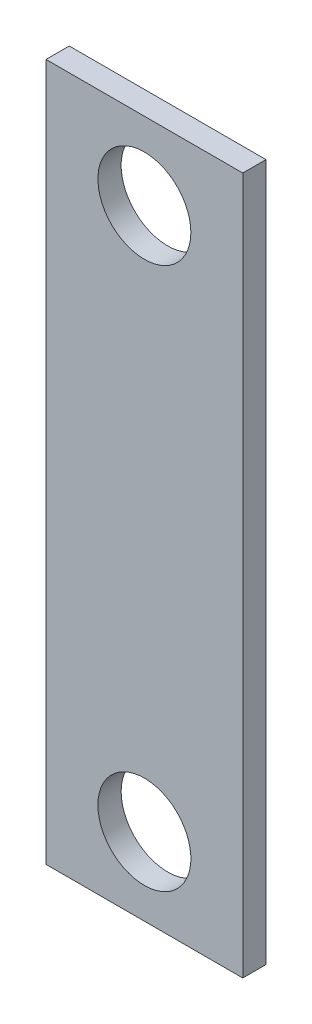
ISO-10303-21;
HEADER;
FILE_DESCRIPTION(('STEP AP214'),'2;1');
FILE_NAME('part.step','',(''),(''),'','','');
FILE_SCHEMA(('AUTOMOTIVE_DESIGN { 1 0 10303 214 1 1 1 1 }'));
ENDSEC;
DATA;
#1=APPLICATION_CONTEXT('core data for automotive mechanical design processes');
#2=APPLICATION_PROTOCOL_DEFINITION('international standard','automotive_design',2000,#1);
#3=PRODUCT_CONTEXT('',#1,'mechanical');
#4=PRODUCT('Part','Part','',(#3));
#5=PRODUCT_RELATED_PRODUCT_CATEGORY('part','',(#4));
#6=PRODUCT_DEFINITION_FORMATION('','',#4);
#7=PRODUCT_DEFINITION_CONTEXT('part definition',#1,'design');
#8=PRODUCT_DEFINITION('design','',#6,#7);
#9=PRODUCT_DEFINITION_SHAPE('','',#8);
#10=(LENGTH_UNIT() NAMED_UNIT(*) SI_UNIT(.MILLI.,.METRE.));
#11=(NAMED_UNIT(*) PLANE_ANGLE_UNIT() SI_UNIT($,.RADIAN.));
#12=(NAMED_UNIT(*) SI_UNIT($,.STERADIAN.) SOLID_ANGLE_UNIT());
#13=UNCERTAINTY_MEASURE_WITH_UNIT(LENGTH_MEASURE(1.E-05),#10,'distance_accuracy_value','');
#14=(GEOMETRIC_REPRESENTATION_CONTEXT(3) GLOBAL_UNCERTAINTY_ASSIGNED_CONTEXT((#13)) GLOBAL_UNIT_ASSIGNED_CONTEXT((#10,
#11,#12)) REPRESENTATION_CONTEXT('',''));
#15=CARTESIAN_POINT('',(0.,0.,0.));
#16=DIRECTION('',(0.,0.,1.));
#17=DIRECTION('',(1.,0.,0.));
#18=AXIS2_PLACEMENT_3D('',#15,#16,#17);
#19=CARTESIAN_POINT('',(0.,0.,6.));
#20=DIRECTION('',(0.,0.,1.));
#21=DIRECTION('',(1.,0.,0.));
#22=AXIS2_PLACEMENT_3D('',#19,#20,#21);
#23=PLANE('',#22);
#24=CARTESIAN_POINT('',(0.,70.,6.));
#25=DIRECTION('',(0.,0.,1.));
#26=DIRECTION('',(1.,0.,0.));
#27=AXIS2_PLACEMENT_3D('',#24,#25,#26);
#28=CIRCLE('',#27,12.);
#29=CARTESIAN_POINT('',(12.,70.,6.));
#30=VERTEX_POINT('',#29);
#31=EDGE_CURVE('E104',#30,#30,#28,.T.);
#32=ORIENTED_EDGE('',*,*,#31,.F.);
#33=EDGE_LOOP('',(#32));
#34=FACE_BOUND('',#33,.T.);
#35=DIRECTION('',(0.,-1.,0.));
#36=VECTOR('',#35,1.);
#37=CARTESIAN_POINT('',(-25.4,-90.,6.));
#38=LINE('',#37,#36);
#39=CARTESIAN_POINT('',(-25.4,90.,6.));
#40=VERTEX_POINT('',#39);
#41=CARTESIAN_POINT('',(-25.4,-90.,6.));
#42=VERTEX_POINT('',#41);
#43=EDGE_CURVE('E89',#40,#42,#38,.T.);
#44=ORIENTED_EDGE('',*,*,#43,.T.);
#45=DIRECTION('',(1.,0.,0.));
#46=VECTOR('',#45,1.);
#47=CARTESIAN_POINT('',(25.4,-90.,6.));
#48=LINE('',#47,#46);
#49=CARTESIAN_POINT('',(25.4,-90.,6.));
#50=VERTEX_POINT('',#49);
#51=EDGE_CURVE('E84',#42,#50,#48,.T.);
#52=ORIENTED_EDGE('',*,*,#51,.T.);
#53=DIRECTION('',(0.,1.,0.));
#54=VECTOR('',#53,1.);
#55=CARTESIAN_POINT('',(25.4,-90.,6.));
#56=LINE('',#55,#54);
#57=CARTESIAN_POINT('',(25.4,90.,6.));
#58=VERTEX_POINT('',#57);
#59=EDGE_CURVE('E87',#50,#58,#56,.T.);
#60=ORIENTED_EDGE('',*,*,#59,.T.);
#61=DIRECTION('',(-1.,0.,0.));
#62=VECTOR('',#61,1.);
#63=CARTESIAN_POINT('',(25.4,90.,6.));
#64=LINE('',#63,#62);
#65=EDGE_CURVE('E54',#58,#40,#64,.T.);
#66=ORIENTED_EDGE('',*,*,#65,.T.);
#67=EDGE_LOOP('',(#44,#52,#60,#66));
#68=FACE_BOUND('',#67,.T.);
#69=CARTESIAN_POINT('',(0.,-70.,6.));
#70=DIRECTION('',(0.,0.,1.));
#71=DIRECTION('',(-1.,0.,0.));
#72=AXIS2_PLACEMENT_3D('',#69,#70,#71);
#73=CIRCLE('',#72,12.);
#74=CARTESIAN_POINT('',(-12.,-70.,6.));
#75=VERTEX_POINT('',#74);
#76=EDGE_CURVE('E119',#75,#75,#73,.T.);
#77=ORIENTED_EDGE('',*,*,#76,.F.);
#78=EDGE_LOOP('',(#77));
#79=FACE_BOUND('',#78,.T.);
#80=ADVANCED_FACE('F37',(#34,#68,#79),#23,.T.);
#81=CARTESIAN_POINT('',(0.,0.,0.));
#82=DIRECTION('',(0.,0.,1.));
#83=DIRECTION('',(1.,0.,0.));
#84=AXIS2_PLACEMENT_3D('',#81,#82,#83);
#85=PLANE('',#84);
#86=DIRECTION('',(0.,-1.,0.));
#87=VECTOR('',#86,1.);
#88=CARTESIAN_POINT('',(-25.4,-90.,0.));
#89=LINE('',#88,#87);
#90=CARTESIAN_POINT('',(-25.4,90.,0.));
#91=VERTEX_POINT('',#90);
#92=CARTESIAN_POINT('',(-25.4,-90.,0.));
#93=VERTEX_POINT('',#92);
#94=EDGE_CURVE('E101',#91,#93,#89,.T.);
#95=ORIENTED_EDGE('',*,*,#94,.F.);
#96=DIRECTION('',(-1.,0.,0.));
#97=VECTOR('',#96,1.);
#98=CARTESIAN_POINT('',(25.4,90.,0.));
#99=LINE('',#98,#97);
#100=CARTESIAN_POINT('',(25.4,90.,0.));
#101=VERTEX_POINT('',#100);
#102=EDGE_CURVE('E77',#101,#91,#99,.T.);
#103=ORIENTED_EDGE('',*,*,#102,.F.);
#104=DIRECTION('',(0.,1.,0.));
#105=VECTOR('',#104,1.);
#106=CARTESIAN_POINT('',(25.4,-90.,0.));
#107=LINE('',#106,#105);
#108=CARTESIAN_POINT('',(25.4,-90.,0.));
#109=VERTEX_POINT('',#108);
#110=EDGE_CURVE('E71',#109,#101,#107,.T.);
#111=ORIENTED_EDGE('',*,*,#110,.F.);
#112=DIRECTION('',(1.,0.,0.));
#113=VECTOR('',#112,1.);
#114=CARTESIAN_POINT('',(25.4,-90.,0.));
#115=LINE('',#114,#113);
#116=EDGE_CURVE('E93',#93,#109,#115,.T.);
#117=ORIENTED_EDGE('',*,*,#116,.F.);
#118=EDGE_LOOP('',(#95,#103,#111,#117));
#119=FACE_BOUND('',#118,.T.);
#120=CARTESIAN_POINT('',(0.,70.,0.));
#121=DIRECTION('',(0.,0.,1.));
#122=DIRECTION('',(1.,0.,0.));
#123=AXIS2_PLACEMENT_3D('',#120,#121,#122);
#124=CIRCLE('',#123,12.);
#125=CARTESIAN_POINT('',(12.,70.,0.));
#126=VERTEX_POINT('',#125);
#127=EDGE_CURVE('E116',#126,#126,#124,.T.);
#128=ORIENTED_EDGE('',*,*,#127,.T.);
#129=EDGE_LOOP('',(#128));
#130=FACE_BOUND('',#129,.T.);
#131=CARTESIAN_POINT('',(0.,-70.,0.));
#132=DIRECTION('',(0.,0.,1.));
#133=DIRECTION('',(-1.,0.,0.));
#134=AXIS2_PLACEMENT_3D('',#131,#132,#133);
#135=CIRCLE('',#134,12.);
#136=CARTESIAN_POINT('',(-12.,-70.,0.));
#137=VERTEX_POINT('',#136);
#138=EDGE_CURVE('E122',#137,#137,#135,.T.);
#139=ORIENTED_EDGE('',*,*,#138,.T.);
#140=EDGE_LOOP('',(#139));
#141=FACE_BOUND('',#140,.T.);
#142=ADVANCED_FACE('F112',(#119,#130,#141),#85,.F.);
#143=CARTESIAN_POINT('',(-25.4,-90.,6.));
#144=DIRECTION('',(1.,0.,0.));
#145=DIRECTION('',(0.,0.,-1.));
#146=AXIS2_PLACEMENT_3D('',#143,#144,#145);
#147=PLANE('',#146);
#148=ORIENTED_EDGE('',*,*,#94,.T.);
#149=DIRECTION('',(0.,0.,-1.));
#150=VECTOR('',#149,1.);
#151=CARTESIAN_POINT('',(-25.4,-90.,6.));
#152=LINE('',#151,#150);
#153=EDGE_CURVE('E11',#42,#93,#152,.T.);
#154=ORIENTED_EDGE('',*,*,#153,.F.);
#155=ORIENTED_EDGE('',*,*,#43,.F.);
#156=DIRECTION('',(0.,0.,-1.));
#157=VECTOR('',#156,1.);
#158=CARTESIAN_POINT('',(-25.4,90.,6.));
#159=LINE('',#158,#157);
#160=EDGE_CURVE('E97',#40,#91,#159,.T.);
#161=ORIENTED_EDGE('',*,*,#160,.T.);
#162=EDGE_LOOP('',(#148,#154,#155,#161));
#163=FACE_BOUND('',#162,.T.);
#164=ADVANCED_FACE('F39',(#163),#147,.F.);
#165=CARTESIAN_POINT('',(25.4,-90.,6.));
#166=DIRECTION('',(0.,1.,0.));
#167=DIRECTION('',(0.,0.,1.));
#168=AXIS2_PLACEMENT_3D('',#165,#166,#167);
#169=PLANE('',#168);
#170=ORIENTED_EDGE('',*,*,#116,.T.);
#171=DIRECTION('',(0.,0.,-1.));
#172=VECTOR('',#171,1.);
#173=CARTESIAN_POINT('',(25.4,-90.,6.));
#174=LINE('',#173,#172);
#175=EDGE_CURVE('E46',#50,#109,#174,.T.);
#176=ORIENTED_EDGE('',*,*,#175,.F.);
#177=ORIENTED_EDGE('',*,*,#51,.F.);
#178=ORIENTED_EDGE('',*,*,#153,.T.);
#179=EDGE_LOOP('',(#170,#176,#177,#178));
#180=FACE_BOUND('',#179,.T.);
#181=ADVANCED_FACE('F92',(#180),#169,.F.);
#182=CARTESIAN_POINT('',(25.4,-90.,6.));
#183=DIRECTION('',(-1.,0.,0.));
#184=DIRECTION('',(0.,0.,1.));
#185=AXIS2_PLACEMENT_3D('',#182,#183,#184);
#186=PLANE('',#185);
#187=ORIENTED_EDGE('',*,*,#110,.T.);
#188=DIRECTION('',(0.,0.,-1.));
#189=VECTOR('',#188,1.);
#190=CARTESIAN_POINT('',(25.4,90.,6.));
#191=LINE('',#190,#189);
#192=EDGE_CURVE('E94',#58,#101,#191,.T.);
#193=ORIENTED_EDGE('',*,*,#192,.F.);
#194=ORIENTED_EDGE('',*,*,#59,.F.);
#195=ORIENTED_EDGE('',*,*,#175,.T.);
#196=EDGE_LOOP('',(#187,#193,#194,#195));
#197=FACE_BOUND('',#196,.T.);
#198=ADVANCED_FACE('F95',(#197),#186,.F.);
#199=CARTESIAN_POINT('',(25.4,90.,6.));
#200=DIRECTION('',(0.,-1.,0.));
#201=DIRECTION('',(0.,0.,-1.));
#202=AXIS2_PLACEMENT_3D('',#199,#200,#201);
#203=PLANE('',#202);
#204=ORIENTED_EDGE('',*,*,#102,.T.);
#205=ORIENTED_EDGE('',*,*,#160,.F.);
#206=ORIENTED_EDGE('',*,*,#65,.F.);
#207=ORIENTED_EDGE('',*,*,#192,.T.);
#208=EDGE_LOOP('',(#204,#205,#206,#207));
#209=FACE_BOUND('',#208,.T.);
#210=ADVANCED_FACE('F109',(#209),#203,.F.);
#211=CARTESIAN_POINT('',(0.,70.,6.));
#212=DIRECTION('',(0.,0.,-1.));
#213=DIRECTION('',(-1.,0.,0.));
#214=AXIS2_PLACEMENT_3D('',#211,#212,#213);
#215=CYLINDRICAL_SURFACE('',#214,12.);
#216=ORIENTED_EDGE('',*,*,#31,.T.);
#217=EDGE_LOOP('',(#216));
#218=FACE_BOUND('',#217,.T.);
#219=ORIENTED_EDGE('',*,*,#127,.F.);
#220=EDGE_LOOP('',(#219));
#221=FACE_BOUND('',#220,.T.);
#222=ADVANCED_FACE('F139',(#218,#221),#215,.F.);
#223=CARTESIAN_POINT('',(0.,-70.,6.));
#224=DIRECTION('',(0.,0.,-1.));
#225=DIRECTION('',(-1.,0.,0.));
#226=AXIS2_PLACEMENT_3D('',#223,#224,#225);
#227=CYLINDRICAL_SURFACE('',#226,12.);
#228=ORIENTED_EDGE('',*,*,#76,.T.);
#229=EDGE_LOOP('',(#228));
#230=FACE_BOUND('',#229,.T.);
#231=ORIENTED_EDGE('',*,*,#138,.F.);
#232=EDGE_LOOP('',(#231));
#233=FACE_BOUND('',#232,.T.);
#234=ADVANCED_FACE('F128',(#230,#233),#227,.F.);
#235=CLOSED_SHELL('',(#80,#142,#164,#181,#198,#210,#222,#234));
#236=MANIFOLD_SOLID_BREP('B2',#235);
#237=ADVANCED_BREP_SHAPE_REPRESENTATION('',(#18,#236),#14);
#238=SHAPE_DEFINITION_REPRESENTATION(#9,#237);
ENDSEC;
END-ISO-10303-21;
